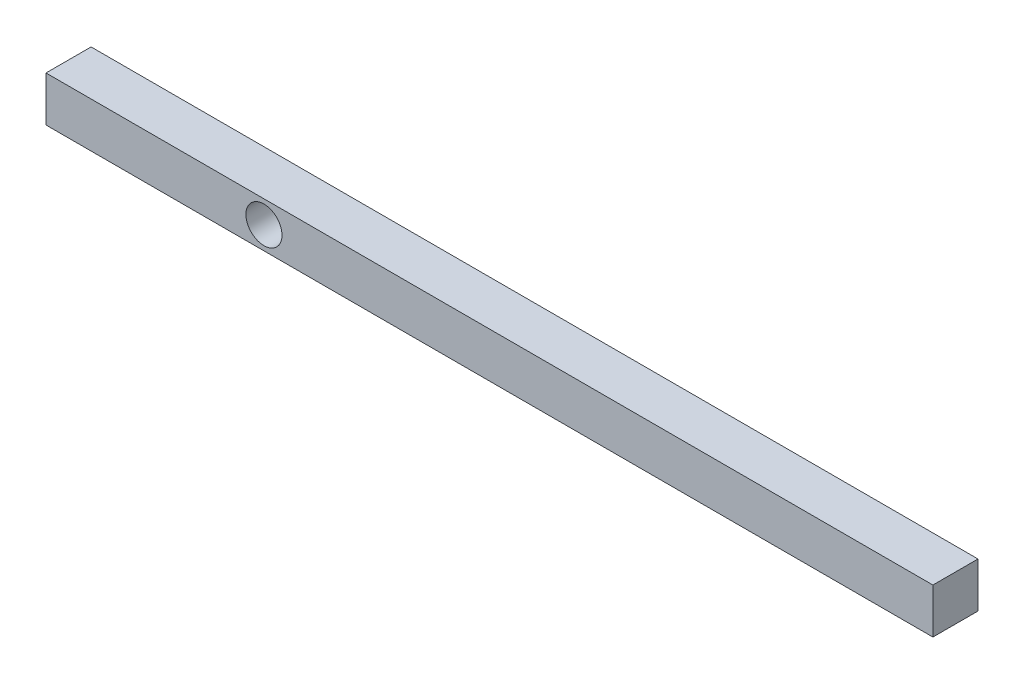
ISO-10303-21;
HEADER;
FILE_DESCRIPTION(('STEP AP214'),'2;1');
FILE_NAME('part.step','',(''),(''),'','','');
FILE_SCHEMA(('AUTOMOTIVE_DESIGN { 1 0 10303 214 1 1 1 1 }'));
ENDSEC;
DATA;
#1=APPLICATION_CONTEXT('core data for automotive mechanical design processes');
#2=APPLICATION_PROTOCOL_DEFINITION('international standard','automotive_design',2000,#1);
#3=PRODUCT_CONTEXT('',#1,'mechanical');
#4=PRODUCT('Part','Part','',(#3));
#5=PRODUCT_RELATED_PRODUCT_CATEGORY('part','',(#4));
#6=PRODUCT_DEFINITION_FORMATION('','',#4);
#7=PRODUCT_DEFINITION_CONTEXT('part definition',#1,'design');
#8=PRODUCT_DEFINITION('design','',#6,#7);
#9=PRODUCT_DEFINITION_SHAPE('','',#8);
#10=(LENGTH_UNIT() NAMED_UNIT(*) SI_UNIT(.MILLI.,.METRE.));
#11=(NAMED_UNIT(*) PLANE_ANGLE_UNIT() SI_UNIT($,.RADIAN.));
#12=(NAMED_UNIT(*) SI_UNIT($,.STERADIAN.) SOLID_ANGLE_UNIT());
#13=UNCERTAINTY_MEASURE_WITH_UNIT(LENGTH_MEASURE(1.E-05),#10,'distance_accuracy_value','');
#14=(GEOMETRIC_REPRESENTATION_CONTEXT(3) GLOBAL_UNCERTAINTY_ASSIGNED_CONTEXT((#13)) GLOBAL_UNIT_ASSIGNED_CONTEXT((#10,
#11,#12)) REPRESENTATION_CONTEXT('',''));
#15=CARTESIAN_POINT('',(0.,0.,0.));
#16=DIRECTION('',(0.,0.,1.));
#17=DIRECTION('',(1.,0.,0.));
#18=AXIS2_PLACEMENT_3D('',#15,#16,#17);
#19=CARTESIAN_POINT('',(-58.,6.,6.));
#20=DIRECTION('',(1.,0.,0.));
#21=DIRECTION('',(0.,0.,-1.));
#22=AXIS2_PLACEMENT_3D('',#19,#20,#21);
#23=PLANE('',#22);
#24=DIRECTION('',(0.,-1.,0.));
#25=VECTOR('',#24,1.);
#26=CARTESIAN_POINT('',(-58.,6.,-6.));
#27=LINE('',#26,#25);
#28=CARTESIAN_POINT('',(-58.,6.,-6.));
#29=VERTEX_POINT('',#28);
#30=CARTESIAN_POINT('',(-58.,-6.,-6.));
#31=VERTEX_POINT('',#30);
#32=EDGE_CURVE('E102',#29,#31,#27,.T.);
#33=ORIENTED_EDGE('',*,*,#32,.T.);
#34=DIRECTION('',(0.,0.,-1.));
#35=VECTOR('',#34,1.);
#36=CARTESIAN_POINT('',(-58.,-6.,6.));
#37=LINE('',#36,#35);
#38=CARTESIAN_POINT('',(-58.,-6.,6.));
#39=VERTEX_POINT('',#38);
#40=EDGE_CURVE('E11',#39,#31,#37,.T.);
#41=ORIENTED_EDGE('',*,*,#40,.F.);
#42=DIRECTION('',(0.,-1.,0.));
#43=VECTOR('',#42,1.);
#44=CARTESIAN_POINT('',(-58.,6.,6.));
#45=LINE('',#44,#43);
#46=CARTESIAN_POINT('',(-58.,6.,6.));
#47=VERTEX_POINT('',#46);
#48=EDGE_CURVE('E93',#47,#39,#45,.T.);
#49=ORIENTED_EDGE('',*,*,#48,.F.);
#50=DIRECTION('',(0.,0.,-1.));
#51=VECTOR('',#50,1.);
#52=CARTESIAN_POINT('',(-58.,6.,6.));
#53=LINE('',#52,#51);
#54=EDGE_CURVE('E99',#47,#29,#53,.T.);
#55=ORIENTED_EDGE('',*,*,#54,.T.);
#56=EDGE_LOOP('',(#33,#41,#49,#55));
#57=FACE_BOUND('',#56,.T.);
#58=ADVANCED_FACE('F39',(#57),#23,.F.);
#59=CARTESIAN_POINT('',(-58.,-6.,6.));
#60=DIRECTION('',(0.,1.,0.));
#61=DIRECTION('',(0.,0.,1.));
#62=AXIS2_PLACEMENT_3D('',#59,#60,#61);
#63=PLANE('',#62);
#64=DIRECTION('',(1.,0.,0.));
#65=VECTOR('',#64,1.);
#66=CARTESIAN_POINT('',(-58.,-6.,-6.));
#67=LINE('',#66,#65);
#68=CARTESIAN_POINT('',(178.,-6.,-6.));
#69=VERTEX_POINT('',#68);
#70=EDGE_CURVE('E92',#31,#69,#67,.T.);
#71=ORIENTED_EDGE('',*,*,#70,.T.);
#72=DIRECTION('',(0.,0.,-1.));
#73=VECTOR('',#72,1.);
#74=CARTESIAN_POINT('',(178.,-6.,6.));
#75=LINE('',#74,#73);
#76=CARTESIAN_POINT('',(178.,-6.,6.));
#77=VERTEX_POINT('',#76);
#78=EDGE_CURVE('E48',#77,#69,#75,.T.);
#79=ORIENTED_EDGE('',*,*,#78,.F.);
#80=DIRECTION('',(1.,0.,0.));
#81=VECTOR('',#80,1.);
#82=CARTESIAN_POINT('',(-58.,-6.,6.));
#83=LINE('',#82,#81);
#84=EDGE_CURVE('E88',#39,#77,#83,.T.);
#85=ORIENTED_EDGE('',*,*,#84,.F.);
#86=ORIENTED_EDGE('',*,*,#40,.T.);
#87=EDGE_LOOP('',(#71,#79,#85,#86));
#88=FACE_BOUND('',#87,.T.);
#89=ADVANCED_FACE('F94',(#88),#63,.F.);
#90=CARTESIAN_POINT('',(178.,-6.,6.));
#91=DIRECTION('',(-1.,0.,0.));
#92=DIRECTION('',(0.,0.,1.));
#93=AXIS2_PLACEMENT_3D('',#90,#91,#92);
#94=PLANE('',#93);
#95=DIRECTION('',(0.,1.,0.));
#96=VECTOR('',#95,1.);
#97=CARTESIAN_POINT('',(178.,-6.,-6.));
#98=LINE('',#97,#96);
#99=CARTESIAN_POINT('',(178.,6.,-6.));
#100=VERTEX_POINT('',#99);
#101=EDGE_CURVE('E71',#69,#100,#98,.T.);
#102=ORIENTED_EDGE('',*,*,#101,.T.);
#103=DIRECTION('',(0.,0.,-1.));
#104=VECTOR('',#103,1.);
#105=CARTESIAN_POINT('',(178.,6.,6.));
#106=LINE('',#105,#104);
#107=CARTESIAN_POINT('',(178.,6.,6.));
#108=VERTEX_POINT('',#107);
#109=EDGE_CURVE('E96',#108,#100,#106,.T.);
#110=ORIENTED_EDGE('',*,*,#109,.F.);
#111=DIRECTION('',(0.,1.,0.));
#112=VECTOR('',#111,1.);
#113=CARTESIAN_POINT('',(178.,-6.,6.));
#114=LINE('',#113,#112);
#115=EDGE_CURVE('E90',#77,#108,#114,.T.);
#116=ORIENTED_EDGE('',*,*,#115,.F.);
#117=ORIENTED_EDGE('',*,*,#78,.T.);
#118=EDGE_LOOP('',(#102,#110,#116,#117));
#119=FACE_BOUND('',#118,.T.);
#120=ADVANCED_FACE('F98',(#119),#94,.F.);
#121=CARTESIAN_POINT('',(178.,6.,6.));
#122=DIRECTION('',(0.,-1.,0.));
#123=DIRECTION('',(0.,0.,-1.));
#124=AXIS2_PLACEMENT_3D('',#121,#122,#123);
#125=PLANE('',#124);
#126=DIRECTION('',(-1.,0.,0.));
#127=VECTOR('',#126,1.);
#128=CARTESIAN_POINT('',(178.,6.,-6.));
#129=LINE('',#128,#127);
#130=EDGE_CURVE('E78',#100,#29,#129,.T.);
#131=ORIENTED_EDGE('',*,*,#130,.T.);
#132=ORIENTED_EDGE('',*,*,#54,.F.);
#133=DIRECTION('',(-1.,0.,0.));
#134=VECTOR('',#133,1.);
#135=CARTESIAN_POINT('',(178.,6.,6.));
#136=LINE('',#135,#134);
#137=EDGE_CURVE('E57',#108,#47,#136,.T.);
#138=ORIENTED_EDGE('',*,*,#137,.F.);
#139=ORIENTED_EDGE('',*,*,#109,.T.);
#140=EDGE_LOOP('',(#131,#132,#138,#139));
#141=FACE_BOUND('',#140,.T.);
#142=ADVANCED_FACE('F115',(#141),#125,.F.);
#143=CARTESIAN_POINT('',(0.,0.,6.));
#144=DIRECTION('',(0.,0.,1.));
#145=DIRECTION('',(1.,0.,0.));
#146=AXIS2_PLACEMENT_3D('',#143,#144,#145);
#147=PLANE('',#146);
#148=CARTESIAN_POINT('',(0.,0.,6.));
#149=DIRECTION('',(0.,0.,1.));
#150=DIRECTION('',(1.,0.,0.));
#151=AXIS2_PLACEMENT_3D('',#148,#149,#150);
#152=CIRCLE('',#151,4.8);
#153=CARTESIAN_POINT('',(4.8,0.,6.));
#154=VERTEX_POINT('',#153);
#155=EDGE_CURVE('E110',#154,#154,#152,.T.);
#156=ORIENTED_EDGE('',*,*,#155,.F.);
#157=EDGE_LOOP('',(#156));
#158=FACE_BOUND('',#157,.T.);
#159=ORIENTED_EDGE('',*,*,#48,.T.);
#160=ORIENTED_EDGE('',*,*,#84,.T.);
#161=ORIENTED_EDGE('',*,*,#115,.T.);
#162=ORIENTED_EDGE('',*,*,#137,.T.);
#163=EDGE_LOOP('',(#159,#160,#161,#162));
#164=FACE_BOUND('',#163,.T.);
#165=ADVANCED_FACE('F87',(#158,#164),#147,.T.);
#166=CARTESIAN_POINT('',(0.,0.,-6.));
#167=DIRECTION('',(0.,0.,1.));
#168=DIRECTION('',(1.,0.,0.));
#169=AXIS2_PLACEMENT_3D('',#166,#167,#168);
#170=PLANE('',#169);
#171=CARTESIAN_POINT('',(0.,0.,-6.));
#172=DIRECTION('',(0.,0.,1.));
#173=DIRECTION('',(1.,0.,0.));
#174=AXIS2_PLACEMENT_3D('',#171,#172,#173);
#175=CIRCLE('',#174,4.8);
#176=CARTESIAN_POINT('',(4.8,0.,-6.));
#177=VERTEX_POINT('',#176);
#178=EDGE_CURVE('E45',#177,#177,#175,.T.);
#179=ORIENTED_EDGE('',*,*,#178,.T.);
#180=EDGE_LOOP('',(#179));
#181=FACE_BOUND('',#180,.T.);
#182=ORIENTED_EDGE('',*,*,#32,.F.);
#183=ORIENTED_EDGE('',*,*,#130,.F.);
#184=ORIENTED_EDGE('',*,*,#101,.F.);
#185=ORIENTED_EDGE('',*,*,#70,.F.);
#186=EDGE_LOOP('',(#182,#183,#184,#185));
#187=FACE_BOUND('',#186,.T.);
#188=ADVANCED_FACE('F113',(#181,#187),#170,.F.);
#189=CARTESIAN_POINT('',(0.,0.,-12.));
#190=DIRECTION('',(0.,0.,1.));
#191=DIRECTION('',(1.,0.,0.));
#192=AXIS2_PLACEMENT_3D('',#189,#190,#191);
#193=CYLINDRICAL_SURFACE('',#192,4.8);
#194=ORIENTED_EDGE('',*,*,#155,.T.);
#195=EDGE_LOOP('',(#194));
#196=FACE_BOUND('',#195,.T.);
#197=ORIENTED_EDGE('',*,*,#178,.F.);
#198=EDGE_LOOP('',(#197));
#199=FACE_BOUND('',#198,.T.);
#200=ADVANCED_FACE('F124',(#196,#199),#193,.F.);
#201=CLOSED_SHELL('',(#58,#89,#120,#142,#165,#188,#200));
#202=MANIFOLD_SOLID_BREP('B2',#201);
#203=ADVANCED_BREP_SHAPE_REPRESENTATION('',(#18,#202),#14);
#204=SHAPE_DEFINITION_REPRESENTATION(#9,#203);
ENDSEC;
END-ISO-10303-21;
